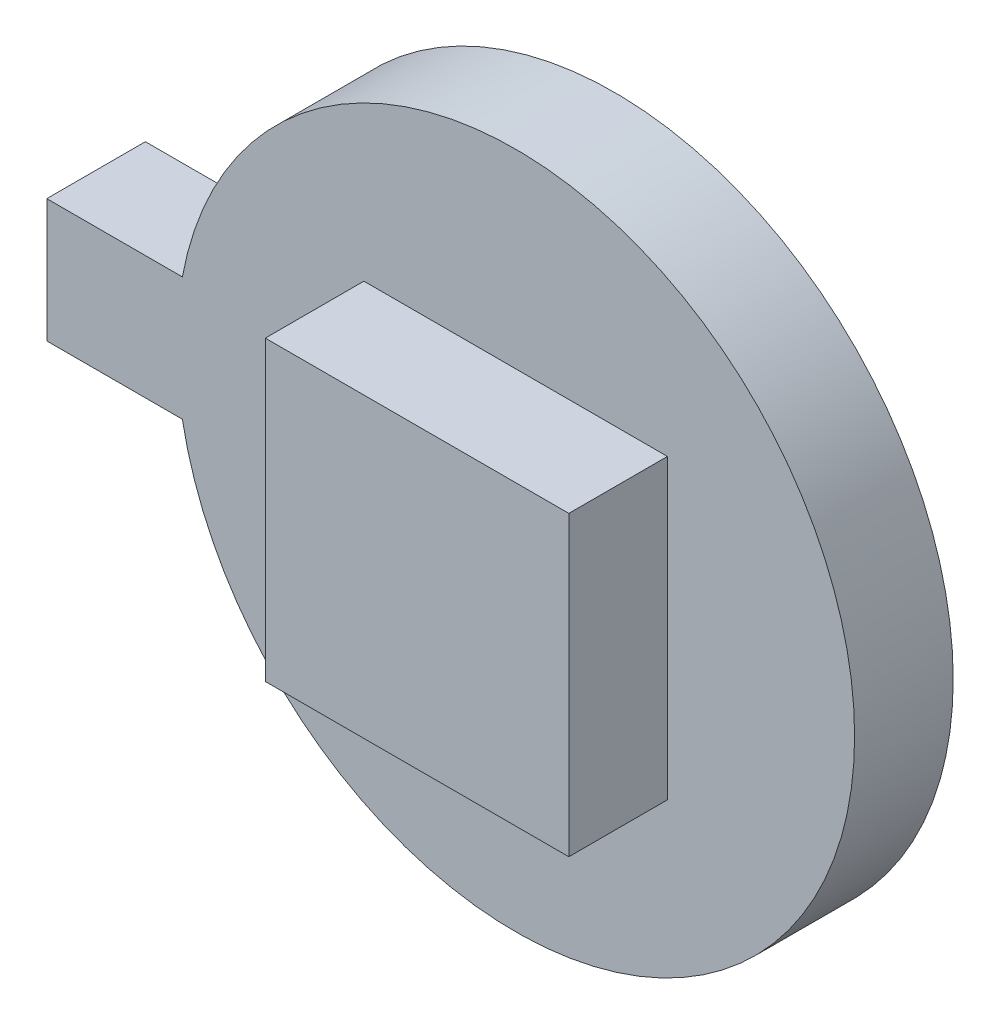
ISO-10303-21;
HEADER;
FILE_DESCRIPTION(('STEP AP214'),'2;1');
FILE_NAME('part.step','',(''),(''),'','','');
FILE_SCHEMA(('AUTOMOTIVE_DESIGN { 1 0 10303 214 1 1 1 1 }'));
ENDSEC;
DATA;
#1=APPLICATION_CONTEXT('core data for automotive mechanical design processes');
#2=APPLICATION_PROTOCOL_DEFINITION('international standard','automotive_design',2000,#1);
#3=PRODUCT_CONTEXT('',#1,'mechanical');
#4=PRODUCT('Part','Part','',(#3));
#5=PRODUCT_RELATED_PRODUCT_CATEGORY('part','',(#4));
#6=PRODUCT_DEFINITION_FORMATION('','',#4);
#7=PRODUCT_DEFINITION_CONTEXT('part definition',#1,'design');
#8=PRODUCT_DEFINITION('design','',#6,#7);
#9=PRODUCT_DEFINITION_SHAPE('','',#8);
#10=(LENGTH_UNIT() NAMED_UNIT(*) SI_UNIT(.MILLI.,.METRE.));
#11=(NAMED_UNIT(*) PLANE_ANGLE_UNIT() SI_UNIT($,.RADIAN.));
#12=(NAMED_UNIT(*) SI_UNIT($,.STERADIAN.) SOLID_ANGLE_UNIT());
#13=UNCERTAINTY_MEASURE_WITH_UNIT(LENGTH_MEASURE(1.E-05),#10,'distance_accuracy_value','');
#14=(GEOMETRIC_REPRESENTATION_CONTEXT(3) GLOBAL_UNCERTAINTY_ASSIGNED_CONTEXT((#13)) GLOBAL_UNIT_ASSIGNED_CONTEXT((#10,
#11,#12)) REPRESENTATION_CONTEXT('',''));
#15=CARTESIAN_POINT('',(0.,0.,0.));
#16=DIRECTION('',(0.,0.,1.));
#17=DIRECTION('',(1.,0.,0.));
#18=AXIS2_PLACEMENT_3D('',#15,#16,#17);
#19=CARTESIAN_POINT('',(0.,0.,1.6));
#20=DIRECTION('',(0.,0.,-1.));
#21=DIRECTION('',(-1.,0.,0.));
#22=AXIS2_PLACEMENT_3D('',#19,#20,#21);
#23=CYLINDRICAL_SURFACE('',#22,5.5);
#24=CARTESIAN_POINT('',(0.,0.,0.));
#25=DIRECTION('',(0.,0.,1.));
#26=DIRECTION('',(1.,0.,0.));
#27=AXIS2_PLACEMENT_3D('',#24,#25,#26);
#28=CIRCLE('',#27,5.5);
#29=CARTESIAN_POINT('',(-5.40832691319598,-1.,0.));
#30=VERTEX_POINT('',#29);
#31=CARTESIAN_POINT('',(-5.40832691319598,1.,0.));
#32=VERTEX_POINT('',#31);
#33=EDGE_CURVE('E119',#30,#32,#28,.T.);
#34=ORIENTED_EDGE('',*,*,#33,.T.);
#35=DIRECTION('',(0.,0.,-1.));
#36=VECTOR('',#35,1.);
#37=CARTESIAN_POINT('',(-5.40832691319598,1.,1.6));
#38=LINE('',#37,#36);
#39=CARTESIAN_POINT('',(-5.40832691319598,1.,1.6));
#40=VERTEX_POINT('',#39);
#41=EDGE_CURVE('E11',#40,#32,#38,.T.);
#42=ORIENTED_EDGE('',*,*,#41,.F.);
#43=CARTESIAN_POINT('',(0.,0.,1.6));
#44=DIRECTION('',(0.,0.,1.));
#45=DIRECTION('',(1.,0.,0.));
#46=AXIS2_PLACEMENT_3D('',#43,#44,#45);
#47=CIRCLE('',#46,5.5);
#48=CARTESIAN_POINT('',(-5.40832691319598,-1.,1.6));
#49=VERTEX_POINT('',#48);
#50=EDGE_CURVE('E128',#49,#40,#47,.T.);
#51=ORIENTED_EDGE('',*,*,#50,.F.);
#52=DIRECTION('',(0.,0.,-1.));
#53=VECTOR('',#52,1.);
#54=CARTESIAN_POINT('',(-5.40832691319598,-1.,1.6));
#55=LINE('',#54,#53);
#56=EDGE_CURVE('E137',#49,#30,#55,.T.);
#57=ORIENTED_EDGE('',*,*,#56,.T.);
#58=EDGE_LOOP('',(#34,#42,#51,#57));
#59=FACE_BOUND('',#58,.T.);
#60=ADVANCED_FACE('F35',(#59),#23,.T.);
#61=CARTESIAN_POINT('',(-5.40832691319598,1.,1.6));
#62=DIRECTION('',(0.,-1.,0.));
#63=DIRECTION('',(1.,0.,0.));
#64=AXIS2_PLACEMENT_3D('',#61,#62,#63);
#65=PLANE('',#64);
#66=DIRECTION('',(-1.,0.,0.));
#67=VECTOR('',#66,1.);
#68=CARTESIAN_POINT('',(-5.40832691319598,1.,0.));
#69=LINE('',#68,#67);
#70=CARTESIAN_POINT('',(-7.60832691319598,1.,0.));
#71=VERTEX_POINT('',#70);
#72=EDGE_CURVE('E122',#32,#71,#69,.T.);
#73=ORIENTED_EDGE('',*,*,#72,.T.);
#74=DIRECTION('',(0.,0.,-1.));
#75=VECTOR('',#74,1.);
#76=CARTESIAN_POINT('',(-7.60832691319598,1.,1.6));
#77=LINE('',#76,#75);
#78=CARTESIAN_POINT('',(-7.60832691319598,1.,1.6));
#79=VERTEX_POINT('',#78);
#80=EDGE_CURVE('E42',#79,#71,#77,.T.);
#81=ORIENTED_EDGE('',*,*,#80,.F.);
#82=DIRECTION('',(-1.,0.,0.));
#83=VECTOR('',#82,1.);
#84=CARTESIAN_POINT('',(-5.40832691319598,1.,1.6));
#85=LINE('',#84,#83);
#86=EDGE_CURVE('E131',#40,#79,#85,.T.);
#87=ORIENTED_EDGE('',*,*,#86,.F.);
#88=ORIENTED_EDGE('',*,*,#41,.T.);
#89=EDGE_LOOP('',(#73,#81,#87,#88));
#90=FACE_BOUND('',#89,.T.);
#91=ADVANCED_FACE('F168',(#90),#65,.F.);
#92=CARTESIAN_POINT('',(-7.60832691319598,1.,1.6));
#93=DIRECTION('',(1.,0.,0.));
#94=DIRECTION('',(0.,0.,-1.));
#95=AXIS2_PLACEMENT_3D('',#92,#93,#94);
#96=PLANE('',#95);
#97=DIRECTION('',(0.,-1.,0.));
#98=VECTOR('',#97,1.);
#99=CARTESIAN_POINT('',(-7.60832691319598,1.,0.));
#100=LINE('',#99,#98);
#101=CARTESIAN_POINT('',(-7.60832691319598,-1.,0.));
#102=VERTEX_POINT('',#101);
#103=EDGE_CURVE('E140',#71,#102,#100,.T.);
#104=ORIENTED_EDGE('',*,*,#103,.T.);
#105=DIRECTION('',(0.,0.,-1.));
#106=VECTOR('',#105,1.);
#107=CARTESIAN_POINT('',(-7.60832691319598,-1.,1.6));
#108=LINE('',#107,#106);
#109=CARTESIAN_POINT('',(-7.60832691319598,-1.,1.6));
#110=VERTEX_POINT('',#109);
#111=EDGE_CURVE('E145',#110,#102,#108,.T.);
#112=ORIENTED_EDGE('',*,*,#111,.F.);
#113=DIRECTION('',(0.,-1.,0.));
#114=VECTOR('',#113,1.);
#115=CARTESIAN_POINT('',(-7.60832691319598,1.,1.6));
#116=LINE('',#115,#114);
#117=EDGE_CURVE('E134',#79,#110,#116,.T.);
#118=ORIENTED_EDGE('',*,*,#117,.F.);
#119=ORIENTED_EDGE('',*,*,#80,.T.);
#120=EDGE_LOOP('',(#104,#112,#118,#119));
#121=FACE_BOUND('',#120,.T.);
#122=ADVANCED_FACE('F152',(#121),#96,.F.);
#123=CARTESIAN_POINT('',(-5.40832691319598,-1.,1.6));
#124=DIRECTION('',(0.,1.,0.));
#125=DIRECTION('',(-1.,0.,0.));
#126=AXIS2_PLACEMENT_3D('',#123,#124,#125);
#127=PLANE('',#126);
#128=DIRECTION('',(1.,0.,0.));
#129=VECTOR('',#128,1.);
#130=CARTESIAN_POINT('',(-5.40832691319598,-1.,0.));
#131=LINE('',#130,#129);
#132=EDGE_CURVE('E132',#102,#30,#131,.T.);
#133=ORIENTED_EDGE('',*,*,#132,.T.);
#134=ORIENTED_EDGE('',*,*,#56,.F.);
#135=DIRECTION('',(1.,0.,0.));
#136=VECTOR('',#135,1.);
#137=CARTESIAN_POINT('',(-5.40832691319598,-1.,1.6));
#138=LINE('',#137,#136);
#139=EDGE_CURVE('E136',#110,#49,#138,.T.);
#140=ORIENTED_EDGE('',*,*,#139,.F.);
#141=ORIENTED_EDGE('',*,*,#111,.T.);
#142=EDGE_LOOP('',(#133,#134,#140,#141));
#143=FACE_BOUND('',#142,.T.);
#144=ADVANCED_FACE('F161',(#143),#127,.F.);
#145=CARTESIAN_POINT('',(0.,0.,1.6));
#146=DIRECTION('',(0.,0.,1.));
#147=DIRECTION('',(1.,0.,0.));
#148=AXIS2_PLACEMENT_3D('',#145,#146,#147);
#149=PLANE('',#148);
#150=DIRECTION('',(0.,1.,0.));
#151=VECTOR('',#150,1.);
#152=CARTESIAN_POINT('',(2.46279040117441,-2.41268602380166,1.6));
#153=LINE('',#152,#151);
#154=CARTESIAN_POINT('',(2.46279040117441,-2.41268602380166,1.6));
#155=VERTEX_POINT('',#154);
#156=CARTESIAN_POINT('',(2.46279040117441,2.41268602380166,1.6));
#157=VERTEX_POINT('',#156);
#158=EDGE_CURVE('E49',#155,#157,#153,.T.);
#159=ORIENTED_EDGE('',*,*,#158,.F.);
#160=DIRECTION('',(1.,0.,0.));
#161=VECTOR('',#160,1.);
#162=CARTESIAN_POINT('',(-2.46279040117441,-2.41268602380166,1.6));
#163=LINE('',#162,#161);
#164=CARTESIAN_POINT('',(-2.46279040117441,-2.41268602380166,1.6));
#165=VERTEX_POINT('',#164);
#166=EDGE_CURVE('E53',#165,#155,#163,.T.);
#167=ORIENTED_EDGE('',*,*,#166,.F.);
#168=DIRECTION('',(0.,-1.,0.));
#169=VECTOR('',#168,1.);
#170=CARTESIAN_POINT('',(-2.46279040117441,-2.41268602380166,1.6));
#171=LINE('',#170,#169);
#172=CARTESIAN_POINT('',(-2.46279040117441,2.41268602380166,1.6));
#173=VERTEX_POINT('',#172);
#174=EDGE_CURVE('E262',#173,#165,#171,.T.);
#175=ORIENTED_EDGE('',*,*,#174,.F.);
#176=DIRECTION('',(-1.,0.,0.));
#177=VECTOR('',#176,1.);
#178=CARTESIAN_POINT('',(-2.46279040117441,2.41268602380166,1.6));
#179=LINE('',#178,#177);
#180=EDGE_CURVE('E268',#157,#173,#179,.T.);
#181=ORIENTED_EDGE('',*,*,#180,.F.);
#182=EDGE_LOOP('',(#159,#167,#175,#181));
#183=FACE_BOUND('',#182,.T.);
#184=ORIENTED_EDGE('',*,*,#50,.T.);
#185=ORIENTED_EDGE('',*,*,#86,.T.);
#186=ORIENTED_EDGE('',*,*,#117,.T.);
#187=ORIENTED_EDGE('',*,*,#139,.T.);
#188=EDGE_LOOP('',(#184,#185,#186,#187));
#189=FACE_BOUND('',#188,.T.);
#190=ADVANCED_FACE('F167',(#183,#189),#149,.T.);
#191=CARTESIAN_POINT('',(0.,0.,0.));
#192=DIRECTION('',(0.,0.,1.));
#193=DIRECTION('',(1.,0.,0.));
#194=AXIS2_PLACEMENT_3D('',#191,#192,#193);
#195=PLANE('',#194);
#196=ORIENTED_EDGE('',*,*,#33,.F.);
#197=ORIENTED_EDGE('',*,*,#132,.F.);
#198=ORIENTED_EDGE('',*,*,#103,.F.);
#199=ORIENTED_EDGE('',*,*,#72,.F.);
#200=EDGE_LOOP('',(#196,#197,#198,#199));
#201=FACE_BOUND('',#200,.T.);
#202=ADVANCED_FACE('F158',(#201),#195,.F.);
#203=CARTESIAN_POINT('',(2.46279040117441,-2.41268602380166,3.2));
#204=DIRECTION('',(-1.,0.,0.));
#205=DIRECTION('',(0.,0.,1.));
#206=AXIS2_PLACEMENT_3D('',#203,#204,#205);
#207=PLANE('',#206);
#208=ORIENTED_EDGE('',*,*,#158,.T.);
#209=DIRECTION('',(0.,0.,-1.));
#210=VECTOR('',#209,1.);
#211=CARTESIAN_POINT('',(2.46279040117441,2.41268602380166,3.2));
#212=LINE('',#211,#210);
#213=CARTESIAN_POINT('',(2.46279040117441,2.41268602380166,3.2));
#214=VERTEX_POINT('',#213);
#215=EDGE_CURVE('E102',#214,#157,#212,.T.);
#216=ORIENTED_EDGE('',*,*,#215,.F.);
#217=DIRECTION('',(0.,1.,0.));
#218=VECTOR('',#217,1.);
#219=CARTESIAN_POINT('',(2.46279040117441,-2.41268602380166,3.2));
#220=LINE('',#219,#218);
#221=CARTESIAN_POINT('',(2.46279040117441,-2.41268602380166,3.2));
#222=VERTEX_POINT('',#221);
#223=EDGE_CURVE('E108',#222,#214,#220,.T.);
#224=ORIENTED_EDGE('',*,*,#223,.F.);
#225=DIRECTION('',(0.,0.,-1.));
#226=VECTOR('',#225,1.);
#227=CARTESIAN_POINT('',(2.46279040117441,-2.41268602380166,3.2));
#228=LINE('',#227,#226);
#229=EDGE_CURVE('E260',#222,#155,#228,.T.);
#230=ORIENTED_EDGE('',*,*,#229,.T.);
#231=EDGE_LOOP('',(#208,#216,#224,#230));
#232=FACE_BOUND('',#231,.T.);
#233=ADVANCED_FACE('F118',(#232),#207,.F.);
#234=CARTESIAN_POINT('',(-2.46279040117441,2.41268602380166,3.2));
#235=DIRECTION('',(0.,-1.,0.));
#236=DIRECTION('',(0.,0.,-1.));
#237=AXIS2_PLACEMENT_3D('',#234,#235,#236);
#238=PLANE('',#237);
#239=ORIENTED_EDGE('',*,*,#180,.T.);
#240=DIRECTION('',(0.,0.,-1.));
#241=VECTOR('',#240,1.);
#242=CARTESIAN_POINT('',(-2.46279040117441,2.41268602380166,3.2));
#243=LINE('',#242,#241);
#244=CARTESIAN_POINT('',(-2.46279040117441,2.41268602380166,3.2));
#245=VERTEX_POINT('',#244);
#246=EDGE_CURVE('E104',#245,#173,#243,.T.);
#247=ORIENTED_EDGE('',*,*,#246,.F.);
#248=DIRECTION('',(-1.,0.,0.));
#249=VECTOR('',#248,1.);
#250=CARTESIAN_POINT('',(-2.46279040117441,2.41268602380166,3.2));
#251=LINE('',#250,#249);
#252=EDGE_CURVE('E97',#214,#245,#251,.T.);
#253=ORIENTED_EDGE('',*,*,#252,.F.);
#254=ORIENTED_EDGE('',*,*,#215,.T.);
#255=EDGE_LOOP('',(#239,#247,#253,#254));
#256=FACE_BOUND('',#255,.T.);
#257=ADVANCED_FACE('F100',(#256),#238,.F.);
#258=CARTESIAN_POINT('',(-2.46279040117441,-2.41268602380166,3.2));
#259=DIRECTION('',(1.,0.,0.));
#260=DIRECTION('',(0.,0.,-1.));
#261=AXIS2_PLACEMENT_3D('',#258,#259,#260);
#262=PLANE('',#261);
#263=ORIENTED_EDGE('',*,*,#174,.T.);
#264=DIRECTION('',(0.,0.,-1.));
#265=VECTOR('',#264,1.);
#266=CARTESIAN_POINT('',(-2.46279040117441,-2.41268602380166,3.2));
#267=LINE('',#266,#265);
#268=CARTESIAN_POINT('',(-2.46279040117441,-2.41268602380166,3.2));
#269=VERTEX_POINT('',#268);
#270=EDGE_CURVE('E124',#269,#165,#267,.T.);
#271=ORIENTED_EDGE('',*,*,#270,.F.);
#272=DIRECTION('',(0.,-1.,0.));
#273=VECTOR('',#272,1.);
#274=CARTESIAN_POINT('',(-2.46279040117441,-2.41268602380166,3.2));
#275=LINE('',#274,#273);
#276=EDGE_CURVE('E107',#245,#269,#275,.T.);
#277=ORIENTED_EDGE('',*,*,#276,.F.);
#278=ORIENTED_EDGE('',*,*,#246,.T.);
#279=EDGE_LOOP('',(#263,#271,#277,#278));
#280=FACE_BOUND('',#279,.T.);
#281=ADVANCED_FACE('F186',(#280),#262,.F.);
#282=CARTESIAN_POINT('',(-2.46279040117441,-2.41268602380166,3.2));
#283=DIRECTION('',(0.,1.,0.));
#284=DIRECTION('',(0.,0.,1.));
#285=AXIS2_PLACEMENT_3D('',#282,#283,#284);
#286=PLANE('',#285);
#287=ORIENTED_EDGE('',*,*,#166,.T.);
#288=ORIENTED_EDGE('',*,*,#229,.F.);
#289=DIRECTION('',(1.,0.,0.));
#290=VECTOR('',#289,1.);
#291=CARTESIAN_POINT('',(-2.46279040117441,-2.41268602380166,3.2));
#292=LINE('',#291,#290);
#293=EDGE_CURVE('E113',#269,#222,#292,.T.);
#294=ORIENTED_EDGE('',*,*,#293,.F.);
#295=ORIENTED_EDGE('',*,*,#270,.T.);
#296=EDGE_LOOP('',(#287,#288,#294,#295));
#297=FACE_BOUND('',#296,.T.);
#298=ADVANCED_FACE('F189',(#297),#286,.F.);
#299=CARTESIAN_POINT('',(0.,0.,3.2));
#300=DIRECTION('',(0.,0.,-1.));
#301=DIRECTION('',(-1.,0.,0.));
#302=AXIS2_PLACEMENT_3D('',#299,#300,#301);
#303=PLANE('',#302);
#304=ORIENTED_EDGE('',*,*,#223,.T.);
#305=ORIENTED_EDGE('',*,*,#252,.T.);
#306=ORIENTED_EDGE('',*,*,#276,.T.);
#307=ORIENTED_EDGE('',*,*,#293,.T.);
#308=EDGE_LOOP('',(#304,#305,#306,#307));
#309=FACE_BOUND('',#308,.T.);
#310=ADVANCED_FACE('F111',(#309),#303,.F.);
#311=CLOSED_SHELL('',(#60,#91,#122,#144,#190,#202,#233,#257,#281,#298,#310));
#312=MANIFOLD_SOLID_BREP('B2',#311);
#313=ADVANCED_BREP_SHAPE_REPRESENTATION('',(#18,#312),#14);
#314=SHAPE_DEFINITION_REPRESENTATION(#9,#313);
ENDSEC;
END-ISO-10303-21;
